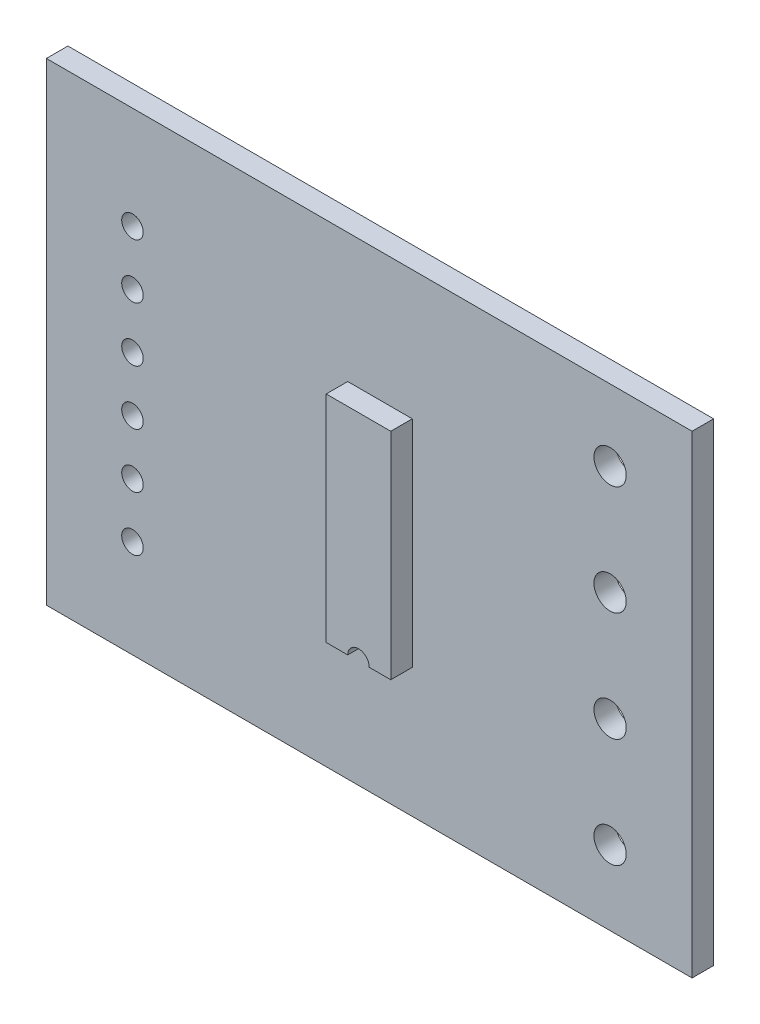
ISO-10303-21;
HEADER;
FILE_DESCRIPTION(('STEP AP214'),'2;1');
FILE_NAME('part.step','',(''),(''),'','','');
FILE_SCHEMA(('AUTOMOTIVE_DESIGN { 1 0 10303 214 1 1 1 1 }'));
ENDSEC;
DATA;
#1=APPLICATION_CONTEXT('core data for automotive mechanical design processes');
#2=APPLICATION_PROTOCOL_DEFINITION('international standard','automotive_design',2000,#1);
#3=PRODUCT_CONTEXT('',#1,'mechanical');
#4=PRODUCT('Part','Part','',(#3));
#5=PRODUCT_RELATED_PRODUCT_CATEGORY('part','',(#4));
#6=PRODUCT_DEFINITION_FORMATION('','',#4);
#7=PRODUCT_DEFINITION_CONTEXT('part definition',#1,'design');
#8=PRODUCT_DEFINITION('design','',#6,#7);
#9=PRODUCT_DEFINITION_SHAPE('','',#8);
#10=(LENGTH_UNIT() NAMED_UNIT(*) SI_UNIT(.MILLI.,.METRE.));
#11=(NAMED_UNIT(*) PLANE_ANGLE_UNIT() SI_UNIT($,.RADIAN.));
#12=(NAMED_UNIT(*) SI_UNIT($,.STERADIAN.) SOLID_ANGLE_UNIT());
#13=UNCERTAINTY_MEASURE_WITH_UNIT(LENGTH_MEASURE(1.E-05),#10,'distance_accuracy_value','');
#14=(GEOMETRIC_REPRESENTATION_CONTEXT(3) GLOBAL_UNCERTAINTY_ASSIGNED_CONTEXT((#13)) GLOBAL_UNIT_ASSIGNED_CONTEXT((#10,
#11,#12)) REPRESENTATION_CONTEXT('',''));
#15=CARTESIAN_POINT('',(0.,0.,0.));
#16=DIRECTION('',(0.,0.,1.));
#17=DIRECTION('',(1.,0.,0.));
#18=AXIS2_PLACEMENT_3D('',#15,#16,#17);
#19=CARTESIAN_POINT('',(14.,6.,2.));
#20=DIRECTION('',(0.,1.,0.));
#21=DIRECTION('',(0.,0.,1.));
#22=AXIS2_PLACEMENT_3D('',#19,#20,#21);
#23=PLANE('',#22);
#24=DIRECTION('',(1.,0.,0.));
#25=VECTOR('',#24,1.);
#26=CARTESIAN_POINT('',(14.,6.,1.));
#27=LINE('',#26,#25);
#28=CARTESIAN_POINT('',(14.,6.,1.));
#29=VERTEX_POINT('',#28);
#30=CARTESIAN_POINT('',(15.,6.,1.));
#31=VERTEX_POINT('',#30);
#32=EDGE_CURVE('E67',#29,#31,#27,.T.);
#33=ORIENTED_EDGE('',*,*,#32,.T.);
#34=DIRECTION('',(0.,0.,1.));
#35=VECTOR('',#34,1.);
#36=CARTESIAN_POINT('',(15.,6.,1.));
#37=LINE('',#36,#35);
#38=CARTESIAN_POINT('',(15.,6.,2.));
#39=VERTEX_POINT('',#38);
#40=EDGE_CURVE('E122',#31,#39,#37,.T.);
#41=ORIENTED_EDGE('',*,*,#40,.T.);
#42=DIRECTION('',(1.,0.,0.));
#43=VECTOR('',#42,1.);
#44=CARTESIAN_POINT('',(14.,6.,2.));
#45=LINE('',#44,#43);
#46=CARTESIAN_POINT('',(14.,6.,2.));
#47=VERTEX_POINT('',#46);
#48=EDGE_CURVE('E569',#47,#39,#45,.T.);
#49=ORIENTED_EDGE('',*,*,#48,.F.);
#50=DIRECTION('',(0.,0.,-1.));
#51=VECTOR('',#50,1.);
#52=CARTESIAN_POINT('',(14.,6.,2.));
#53=LINE('',#52,#51);
#54=EDGE_CURVE('E168',#47,#29,#53,.T.);
#55=ORIENTED_EDGE('',*,*,#54,.T.);
#56=EDGE_LOOP('',(#33,#41,#49,#55));
#57=FACE_BOUND('',#56,.T.);
#58=ADVANCED_FACE('F43',(#57),#23,.F.);
#59=CARTESIAN_POINT('',(0.,0.,1.));
#60=DIRECTION('',(0.,0.,-1.));
#61=DIRECTION('',(-1.,0.,0.));
#62=AXIS2_PLACEMENT_3D('',#59,#60,#61);
#63=PLANE('',#62);
#64=DIRECTION('',(0.,-1.,0.));
#65=VECTOR('',#64,1.);
#66=CARTESIAN_POINT('',(0.,0.,1.));
#67=LINE('',#66,#65);
#68=CARTESIAN_POINT('',(0.,22.,1.));
#69=VERTEX_POINT('',#68);
#70=CARTESIAN_POINT('',(0.,0.,1.));
#71=VERTEX_POINT('',#70);
#72=EDGE_CURVE('E252',#69,#71,#67,.T.);
#73=ORIENTED_EDGE('',*,*,#72,.T.);
#74=DIRECTION('',(1.,0.,0.));
#75=VECTOR('',#74,1.);
#76=CARTESIAN_POINT('',(0.,0.,1.));
#77=LINE('',#76,#75);
#78=CARTESIAN_POINT('',(30.,0.,1.));
#79=VERTEX_POINT('',#78);
#80=EDGE_CURVE('E256',#71,#79,#77,.T.);
#81=ORIENTED_EDGE('',*,*,#80,.T.);
#82=DIRECTION('',(0.,1.,0.));
#83=VECTOR('',#82,1.);
#84=CARTESIAN_POINT('',(30.,0.,1.));
#85=LINE('',#84,#83);
#86=CARTESIAN_POINT('',(30.,22.,1.));
#87=VERTEX_POINT('',#86);
#88=EDGE_CURVE('E260',#79,#87,#85,.T.);
#89=ORIENTED_EDGE('',*,*,#88,.T.);
#90=DIRECTION('',(-1.,0.,0.));
#91=VECTOR('',#90,1.);
#92=CARTESIAN_POINT('',(0.,22.,1.));
#93=LINE('',#92,#91);
#94=EDGE_CURVE('E263',#87,#69,#93,.T.);
#95=ORIENTED_EDGE('',*,*,#94,.T.);
#96=EDGE_LOOP('',(#73,#81,#89,#95));
#97=FACE_BOUND('',#96,.T.);
#98=CARTESIAN_POINT('',(4.,17.25,1.));
#99=DIRECTION('',(0.,0.,1.));
#100=DIRECTION('',(1.,0.,0.));
#101=AXIS2_PLACEMENT_3D('',#98,#99,#100);
#102=CIRCLE('',#101,0.500000000000001);
#103=CARTESIAN_POINT('',(4.5,17.25,1.));
#104=VERTEX_POINT('',#103);
#105=EDGE_CURVE('E216',#104,#104,#102,.T.);
#106=ORIENTED_EDGE('',*,*,#105,.F.);
#107=EDGE_LOOP('',(#106));
#108=FACE_BOUND('',#107,.T.);
#109=CARTESIAN_POINT('',(26.19,3.45,1.));
#110=DIRECTION('',(0.,0.,1.));
#111=DIRECTION('',(1.,0.,0.));
#112=AXIS2_PLACEMENT_3D('',#109,#110,#111);
#113=CIRCLE('',#112,0.750000000000002);
#114=CARTESIAN_POINT('',(26.94,3.45,1.));
#115=VERTEX_POINT('',#114);
#116=EDGE_CURVE('E172',#115,#115,#113,.T.);
#117=ORIENTED_EDGE('',*,*,#116,.F.);
#118=EDGE_LOOP('',(#117));
#119=FACE_BOUND('',#118,.T.);
#120=CARTESIAN_POINT('',(4.,14.71,1.));
#121=DIRECTION('',(0.,0.,1.));
#122=DIRECTION('',(1.,0.,0.));
#123=AXIS2_PLACEMENT_3D('',#120,#121,#122);
#124=CIRCLE('',#123,0.500000000000001);
#125=CARTESIAN_POINT('',(4.5,14.71,1.));
#126=VERTEX_POINT('',#125);
#127=EDGE_CURVE('E212',#126,#126,#124,.T.);
#128=ORIENTED_EDGE('',*,*,#127,.F.);
#129=EDGE_LOOP('',(#128));
#130=FACE_BOUND('',#129,.T.);
#131=CARTESIAN_POINT('',(4.,12.17,1.));
#132=DIRECTION('',(0.,0.,1.));
#133=DIRECTION('',(1.,0.,0.));
#134=AXIS2_PLACEMENT_3D('',#131,#132,#133);
#135=CIRCLE('',#134,0.500000000000001);
#136=CARTESIAN_POINT('',(4.5,12.17,1.));
#137=VERTEX_POINT('',#136);
#138=EDGE_CURVE('E221',#137,#137,#135,.T.);
#139=ORIENTED_EDGE('',*,*,#138,.F.);
#140=EDGE_LOOP('',(#139));
#141=FACE_BOUND('',#140,.T.);
#142=CARTESIAN_POINT('',(4.,9.63,1.));
#143=DIRECTION('',(0.,0.,1.));
#144=DIRECTION('',(1.,0.,0.));
#145=AXIS2_PLACEMENT_3D('',#142,#143,#144);
#146=CIRCLE('',#145,0.500000000000001);
#147=CARTESIAN_POINT('',(4.5,9.63,1.));
#148=VERTEX_POINT('',#147);
#149=EDGE_CURVE('E229',#148,#148,#146,.T.);
#150=ORIENTED_EDGE('',*,*,#149,.F.);
#151=EDGE_LOOP('',(#150));
#152=FACE_BOUND('',#151,.T.);
#153=CARTESIAN_POINT('',(4.,7.09,1.));
#154=DIRECTION('',(0.,0.,1.));
#155=DIRECTION('',(1.,0.,0.));
#156=AXIS2_PLACEMENT_3D('',#153,#154,#155);
#157=CIRCLE('',#156,0.500000000000001);
#158=CARTESIAN_POINT('',(4.5,7.09,1.));
#159=VERTEX_POINT('',#158);
#160=EDGE_CURVE('E237',#159,#159,#157,.T.);
#161=ORIENTED_EDGE('',*,*,#160,.F.);
#162=EDGE_LOOP('',(#161));
#163=FACE_BOUND('',#162,.T.);
#164=CARTESIAN_POINT('',(26.19,8.53,1.));
#165=DIRECTION('',(0.,0.,1.));
#166=DIRECTION('',(1.,0.,0.));
#167=AXIS2_PLACEMENT_3D('',#164,#165,#166);
#168=CIRCLE('',#167,0.750000000000002);
#169=CARTESIAN_POINT('',(26.94,8.53,1.));
#170=VERTEX_POINT('',#169);
#171=EDGE_CURVE('E189',#170,#170,#168,.T.);
#172=ORIENTED_EDGE('',*,*,#171,.F.);
#173=EDGE_LOOP('',(#172));
#174=FACE_BOUND('',#173,.T.);
#175=CARTESIAN_POINT('',(26.19,13.61,1.));
#176=DIRECTION('',(0.,0.,1.));
#177=DIRECTION('',(1.,0.,0.));
#178=AXIS2_PLACEMENT_3D('',#175,#176,#177);
#179=CIRCLE('',#178,0.750000000000002);
#180=CARTESIAN_POINT('',(26.94,13.61,1.));
#181=VERTEX_POINT('',#180);
#182=EDGE_CURVE('E180',#181,#181,#179,.T.);
#183=ORIENTED_EDGE('',*,*,#182,.F.);
#184=EDGE_LOOP('',(#183));
#185=FACE_BOUND('',#184,.T.);
#186=CARTESIAN_POINT('',(26.19,18.69,1.));
#187=DIRECTION('',(0.,0.,1.));
#188=DIRECTION('',(1.,0.,0.));
#189=AXIS2_PLACEMENT_3D('',#186,#187,#188);
#190=CIRCLE('',#189,0.750000000000002);
#191=CARTESIAN_POINT('',(26.94,18.69,1.));
#192=VERTEX_POINT('',#191);
#193=EDGE_CURVE('E205',#192,#192,#190,.T.);
#194=ORIENTED_EDGE('',*,*,#193,.F.);
#195=EDGE_LOOP('',(#194));
#196=FACE_BOUND('',#195,.T.);
#197=CARTESIAN_POINT('',(4.,4.55,1.));
#198=DIRECTION('',(0.,0.,1.));
#199=DIRECTION('',(1.,0.,0.));
#200=AXIS2_PLACEMENT_3D('',#197,#198,#199);
#201=CIRCLE('',#200,0.500000000000001);
#202=CARTESIAN_POINT('',(4.5,4.55,1.));
#203=VERTEX_POINT('',#202);
#204=EDGE_CURVE('E196',#203,#203,#201,.T.);
#205=ORIENTED_EDGE('',*,*,#204,.F.);
#206=EDGE_LOOP('',(#205));
#207=FACE_BOUND('',#206,.T.);
#208=CARTESIAN_POINT('',(16.,6.,1.));
#209=VERTEX_POINT('',#208);
#210=CARTESIAN_POINT('',(17.,6.,1.));
#211=VERTEX_POINT('',#210);
#212=EDGE_CURVE('E131',#209,#211,#27,.T.);
#213=ORIENTED_EDGE('',*,*,#212,.F.);
#214=CARTESIAN_POINT('',(15.5,6.,1.));
#215=DIRECTION('',(0.,0.,1.));
#216=DIRECTION('',(1.,0.,0.));
#217=AXIS2_PLACEMENT_3D('',#214,#215,#216);
#218=CIRCLE('',#217,0.499999999999997);
#219=EDGE_CURVE('E119',#209,#31,#218,.T.);
#220=ORIENTED_EDGE('',*,*,#219,.T.);
#221=ORIENTED_EDGE('',*,*,#32,.F.);
#222=DIRECTION('',(0.,-1.,0.));
#223=VECTOR('',#222,1.);
#224=CARTESIAN_POINT('',(14.,16.,1.));
#225=LINE('',#224,#223);
#226=CARTESIAN_POINT('',(14.,16.,1.));
#227=VERTEX_POINT('',#226);
#228=EDGE_CURVE('E141',#227,#29,#225,.T.);
#229=ORIENTED_EDGE('',*,*,#228,.F.);
#230=DIRECTION('',(-1.,0.,0.));
#231=VECTOR('',#230,1.);
#232=CARTESIAN_POINT('',(14.,16.,1.));
#233=LINE('',#232,#231);
#234=CARTESIAN_POINT('',(17.,16.,1.));
#235=VERTEX_POINT('',#234);
#236=EDGE_CURVE('E151',#235,#227,#233,.T.);
#237=ORIENTED_EDGE('',*,*,#236,.F.);
#238=DIRECTION('',(0.,1.,0.));
#239=VECTOR('',#238,1.);
#240=CARTESIAN_POINT('',(17.,16.,1.));
#241=LINE('',#240,#239);
#242=EDGE_CURVE('E138',#211,#235,#241,.T.);
#243=ORIENTED_EDGE('',*,*,#242,.F.);
#244=EDGE_LOOP('',(#213,#220,#221,#229,#237,#243));
#245=FACE_BOUND('',#244,.T.);
#246=ADVANCED_FACE('F136',(#97,#108,#119,#130,#141,#152,#163,#174,#185,#196,#207,#245),#63,.F.);
#247=CARTESIAN_POINT('',(0.,0.,1.));
#248=DIRECTION('',(1.,0.,0.));
#249=DIRECTION('',(0.,0.,-1.));
#250=AXIS2_PLACEMENT_3D('',#247,#248,#249);
#251=PLANE('',#250);
#252=DIRECTION('',(0.,-1.,0.));
#253=VECTOR('',#252,1.);
#254=CARTESIAN_POINT('',(0.,0.,0.));
#255=LINE('',#254,#253);
#256=CARTESIAN_POINT('',(0.,22.,0.));
#257=VERTEX_POINT('',#256);
#258=CARTESIAN_POINT('',(0.,0.,0.));
#259=VERTEX_POINT('',#258);
#260=EDGE_CURVE('E248',#257,#259,#255,.T.);
#261=ORIENTED_EDGE('',*,*,#260,.T.);
#262=DIRECTION('',(0.,0.,-1.));
#263=VECTOR('',#262,1.);
#264=CARTESIAN_POINT('',(0.,0.,1.));
#265=LINE('',#264,#263);
#266=EDGE_CURVE('E11',#71,#259,#265,.T.);
#267=ORIENTED_EDGE('',*,*,#266,.F.);
#268=ORIENTED_EDGE('',*,*,#72,.F.);
#269=DIRECTION('',(0.,0.,-1.));
#270=VECTOR('',#269,1.);
#271=CARTESIAN_POINT('',(0.,22.,1.));
#272=LINE('',#271,#270);
#273=EDGE_CURVE('E266',#69,#257,#272,.T.);
#274=ORIENTED_EDGE('',*,*,#273,.T.);
#275=EDGE_LOOP('',(#261,#267,#268,#274));
#276=FACE_BOUND('',#275,.T.);
#277=ADVANCED_FACE('F45',(#276),#251,.F.);
#278=CARTESIAN_POINT('',(0.,0.,1.));
#279=DIRECTION('',(0.,1.,0.));
#280=DIRECTION('',(0.,0.,1.));
#281=AXIS2_PLACEMENT_3D('',#278,#279,#280);
#282=PLANE('',#281);
#283=DIRECTION('',(1.,0.,0.));
#284=VECTOR('',#283,1.);
#285=CARTESIAN_POINT('',(0.,0.,0.));
#286=LINE('',#285,#284);
#287=CARTESIAN_POINT('',(30.,0.,0.));
#288=VERTEX_POINT('',#287);
#289=EDGE_CURVE('E270',#259,#288,#286,.T.);
#290=ORIENTED_EDGE('',*,*,#289,.T.);
#291=DIRECTION('',(0.,0.,-1.));
#292=VECTOR('',#291,1.);
#293=CARTESIAN_POINT('',(30.,0.,1.));
#294=LINE('',#293,#292);
#295=EDGE_CURVE('E52',#79,#288,#294,.T.);
#296=ORIENTED_EDGE('',*,*,#295,.F.);
#297=ORIENTED_EDGE('',*,*,#80,.F.);
#298=ORIENTED_EDGE('',*,*,#266,.T.);
#299=EDGE_LOOP('',(#290,#296,#297,#298));
#300=FACE_BOUND('',#299,.T.);
#301=ADVANCED_FACE('F306',(#300),#282,.F.);
#302=CARTESIAN_POINT('',(30.,0.,1.));
#303=DIRECTION('',(-1.,0.,0.));
#304=DIRECTION('',(0.,0.,1.));
#305=AXIS2_PLACEMENT_3D('',#302,#303,#304);
#306=PLANE('',#305);
#307=DIRECTION('',(0.,1.,0.));
#308=VECTOR('',#307,1.);
#309=CARTESIAN_POINT('',(30.,0.,0.));
#310=LINE('',#309,#308);
#311=CARTESIAN_POINT('',(30.,22.,0.));
#312=VERTEX_POINT('',#311);
#313=EDGE_CURVE('E273',#288,#312,#310,.T.);
#314=ORIENTED_EDGE('',*,*,#313,.T.);
#315=DIRECTION('',(0.,0.,-1.));
#316=VECTOR('',#315,1.);
#317=CARTESIAN_POINT('',(30.,22.,1.));
#318=LINE('',#317,#316);
#319=EDGE_CURVE('E281',#87,#312,#318,.T.);
#320=ORIENTED_EDGE('',*,*,#319,.F.);
#321=ORIENTED_EDGE('',*,*,#88,.F.);
#322=ORIENTED_EDGE('',*,*,#295,.T.);
#323=EDGE_LOOP('',(#314,#320,#321,#322));
#324=FACE_BOUND('',#323,.T.);
#325=ADVANCED_FACE('F290',(#324),#306,.F.);
#326=CARTESIAN_POINT('',(0.,22.,1.));
#327=DIRECTION('',(0.,-1.,0.));
#328=DIRECTION('',(0.,0.,-1.));
#329=AXIS2_PLACEMENT_3D('',#326,#327,#328);
#330=PLANE('',#329);
#331=DIRECTION('',(-1.,0.,0.));
#332=VECTOR('',#331,1.);
#333=CARTESIAN_POINT('',(0.,22.,0.));
#334=LINE('',#333,#332);
#335=EDGE_CURVE('E257',#312,#257,#334,.T.);
#336=ORIENTED_EDGE('',*,*,#335,.T.);
#337=ORIENTED_EDGE('',*,*,#273,.F.);
#338=ORIENTED_EDGE('',*,*,#94,.F.);
#339=ORIENTED_EDGE('',*,*,#319,.T.);
#340=EDGE_LOOP('',(#336,#337,#338,#339));
#341=FACE_BOUND('',#340,.T.);
#342=ADVANCED_FACE('F299',(#341),#330,.F.);
#343=CARTESIAN_POINT('',(0.,0.,0.));
#344=DIRECTION('',(0.,0.,-1.));
#345=DIRECTION('',(-1.,0.,0.));
#346=AXIS2_PLACEMENT_3D('',#343,#344,#345);
#347=PLANE('',#346);
#348=CARTESIAN_POINT('',(4.,4.55,0.));
#349=DIRECTION('',(0.,0.,1.));
#350=DIRECTION('',(1.,0.,0.));
#351=AXIS2_PLACEMENT_3D('',#348,#349,#350);
#352=CIRCLE('',#351,0.500000000000001);
#353=CARTESIAN_POINT('',(4.5,4.55,0.));
#354=VERTEX_POINT('',#353);
#355=EDGE_CURVE('E201',#354,#354,#352,.T.);
#356=ORIENTED_EDGE('',*,*,#355,.T.);
#357=EDGE_LOOP('',(#356));
#358=FACE_BOUND('',#357,.T.);
#359=CARTESIAN_POINT('',(26.19,18.69,0.));
#360=DIRECTION('',(0.,0.,1.));
#361=DIRECTION('',(1.,0.,0.));
#362=AXIS2_PLACEMENT_3D('',#359,#360,#361);
#363=CIRCLE('',#362,0.750000000000002);
#364=CARTESIAN_POINT('',(26.94,18.69,0.));
#365=VERTEX_POINT('',#364);
#366=EDGE_CURVE('E184',#365,#365,#363,.T.);
#367=ORIENTED_EDGE('',*,*,#366,.T.);
#368=EDGE_LOOP('',(#367));
#369=FACE_BOUND('',#368,.T.);
#370=CARTESIAN_POINT('',(26.19,13.61,0.));
#371=DIRECTION('',(0.,0.,1.));
#372=DIRECTION('',(1.,0.,0.));
#373=AXIS2_PLACEMENT_3D('',#370,#371,#372);
#374=CIRCLE('',#373,0.750000000000002);
#375=CARTESIAN_POINT('',(26.94,13.61,0.));
#376=VERTEX_POINT('',#375);
#377=EDGE_CURVE('E185',#376,#376,#374,.T.);
#378=ORIENTED_EDGE('',*,*,#377,.T.);
#379=EDGE_LOOP('',(#378));
#380=FACE_BOUND('',#379,.T.);
#381=CARTESIAN_POINT('',(26.19,8.53,0.));
#382=DIRECTION('',(0.,0.,1.));
#383=DIRECTION('',(1.,0.,0.));
#384=AXIS2_PLACEMENT_3D('',#381,#382,#383);
#385=CIRCLE('',#384,0.750000000000002);
#386=CARTESIAN_POINT('',(26.94,8.53,0.));
#387=VERTEX_POINT('',#386);
#388=EDGE_CURVE('E176',#387,#387,#385,.T.);
#389=ORIENTED_EDGE('',*,*,#388,.T.);
#390=EDGE_LOOP('',(#389));
#391=FACE_BOUND('',#390,.T.);
#392=CARTESIAN_POINT('',(4.,7.09,0.));
#393=DIRECTION('',(0.,0.,1.));
#394=DIRECTION('',(1.,0.,0.));
#395=AXIS2_PLACEMENT_3D('',#392,#393,#394);
#396=CIRCLE('',#395,0.500000000000001);
#397=CARTESIAN_POINT('',(4.5,7.09,0.));
#398=VERTEX_POINT('',#397);
#399=EDGE_CURVE('E200',#398,#398,#396,.T.);
#400=ORIENTED_EDGE('',*,*,#399,.T.);
#401=EDGE_LOOP('',(#400));
#402=FACE_BOUND('',#401,.T.);
#403=CARTESIAN_POINT('',(4.,9.63,0.));
#404=DIRECTION('',(0.,0.,1.));
#405=DIRECTION('',(1.,0.,0.));
#406=AXIS2_PLACEMENT_3D('',#403,#404,#405);
#407=CIRCLE('',#406,0.500000000000001);
#408=CARTESIAN_POINT('',(4.5,9.63,0.));
#409=VERTEX_POINT('',#408);
#410=EDGE_CURVE('E233',#409,#409,#407,.T.);
#411=ORIENTED_EDGE('',*,*,#410,.T.);
#412=EDGE_LOOP('',(#411));
#413=FACE_BOUND('',#412,.T.);
#414=CARTESIAN_POINT('',(4.,12.17,0.));
#415=DIRECTION('',(0.,0.,1.));
#416=DIRECTION('',(1.,0.,0.));
#417=AXIS2_PLACEMENT_3D('',#414,#415,#416);
#418=CIRCLE('',#417,0.500000000000001);
#419=CARTESIAN_POINT('',(4.5,12.17,0.));
#420=VERTEX_POINT('',#419);
#421=EDGE_CURVE('E225',#420,#420,#418,.T.);
#422=ORIENTED_EDGE('',*,*,#421,.T.);
#423=EDGE_LOOP('',(#422));
#424=FACE_BOUND('',#423,.T.);
#425=CARTESIAN_POINT('',(4.,14.71,0.));
#426=DIRECTION('',(0.,0.,1.));
#427=DIRECTION('',(1.,0.,0.));
#428=AXIS2_PLACEMENT_3D('',#425,#426,#427);
#429=CIRCLE('',#428,0.500000000000001);
#430=CARTESIAN_POINT('',(4.5,14.71,0.));
#431=VERTEX_POINT('',#430);
#432=EDGE_CURVE('E217',#431,#431,#429,.T.);
#433=ORIENTED_EDGE('',*,*,#432,.T.);
#434=EDGE_LOOP('',(#433));
#435=FACE_BOUND('',#434,.T.);
#436=CARTESIAN_POINT('',(26.19,3.45,0.));
#437=DIRECTION('',(0.,0.,1.));
#438=DIRECTION('',(1.,0.,0.));
#439=AXIS2_PLACEMENT_3D('',#436,#437,#438);
#440=CIRCLE('',#439,0.750000000000002);
#441=CARTESIAN_POINT('',(26.94,3.45,0.));
#442=VERTEX_POINT('',#441);
#443=EDGE_CURVE('E171',#442,#442,#440,.T.);
#444=ORIENTED_EDGE('',*,*,#443,.T.);
#445=EDGE_LOOP('',(#444));
#446=FACE_BOUND('',#445,.T.);
#447=CARTESIAN_POINT('',(4.,17.25,0.));
#448=DIRECTION('',(0.,0.,1.));
#449=DIRECTION('',(1.,0.,0.));
#450=AXIS2_PLACEMENT_3D('',#447,#448,#449);
#451=CIRCLE('',#450,0.500000000000001);
#452=CARTESIAN_POINT('',(4.5,17.25,0.));
#453=VERTEX_POINT('',#452);
#454=EDGE_CURVE('E244',#453,#453,#451,.T.);
#455=ORIENTED_EDGE('',*,*,#454,.T.);
#456=EDGE_LOOP('',(#455));
#457=FACE_BOUND('',#456,.T.);
#458=ORIENTED_EDGE('',*,*,#260,.F.);
#459=ORIENTED_EDGE('',*,*,#335,.F.);
#460=ORIENTED_EDGE('',*,*,#313,.F.);
#461=ORIENTED_EDGE('',*,*,#289,.F.);
#462=EDGE_LOOP('',(#458,#459,#460,#461));
#463=FACE_BOUND('',#462,.T.);
#464=ADVANCED_FACE('F296',(#358,#369,#380,#391,#402,#413,#424,#435,#446,#457,#463),#347,.T.);
#465=CARTESIAN_POINT('',(4.,17.25,0.));
#466=DIRECTION('',(0.,0.,1.));
#467=DIRECTION('',(1.,0.,0.));
#468=AXIS2_PLACEMENT_3D('',#465,#466,#467);
#469=CYLINDRICAL_SURFACE('',#468,0.500000000000001);
#470=ORIENTED_EDGE('',*,*,#454,.F.);
#471=EDGE_LOOP('',(#470));
#472=FACE_BOUND('',#471,.T.);
#473=ORIENTED_EDGE('',*,*,#105,.T.);
#474=EDGE_LOOP('',(#473));
#475=FACE_BOUND('',#474,.T.);
#476=ADVANCED_FACE('F344',(#472,#475),#469,.F.);
#477=CARTESIAN_POINT('',(26.19,3.45,0.));
#478=DIRECTION('',(0.,0.,1.));
#479=DIRECTION('',(1.,0.,0.));
#480=AXIS2_PLACEMENT_3D('',#477,#478,#479);
#481=CYLINDRICAL_SURFACE('',#480,0.750000000000002);
#482=ORIENTED_EDGE('',*,*,#443,.F.);
#483=EDGE_LOOP('',(#482));
#484=FACE_BOUND('',#483,.T.);
#485=ORIENTED_EDGE('',*,*,#116,.T.);
#486=EDGE_LOOP('',(#485));
#487=FACE_BOUND('',#486,.T.);
#488=ADVANCED_FACE('F340',(#484,#487),#481,.F.);
#489=CARTESIAN_POINT('',(4.,14.71,0.));
#490=DIRECTION('',(0.,0.,1.));
#491=DIRECTION('',(1.,0.,0.));
#492=AXIS2_PLACEMENT_3D('',#489,#490,#491);
#493=CYLINDRICAL_SURFACE('',#492,0.500000000000001);
#494=ORIENTED_EDGE('',*,*,#432,.F.);
#495=EDGE_LOOP('',(#494));
#496=FACE_BOUND('',#495,.T.);
#497=ORIENTED_EDGE('',*,*,#127,.T.);
#498=EDGE_LOOP('',(#497));
#499=FACE_BOUND('',#498,.T.);
#500=ADVANCED_FACE('F343',(#496,#499),#493,.F.);
#501=CARTESIAN_POINT('',(4.,12.17,0.));
#502=DIRECTION('',(0.,0.,1.));
#503=DIRECTION('',(1.,0.,0.));
#504=AXIS2_PLACEMENT_3D('',#501,#502,#503);
#505=CYLINDRICAL_SURFACE('',#504,0.500000000000001);
#506=ORIENTED_EDGE('',*,*,#421,.F.);
#507=EDGE_LOOP('',(#506));
#508=FACE_BOUND('',#507,.T.);
#509=ORIENTED_EDGE('',*,*,#138,.T.);
#510=EDGE_LOOP('',(#509));
#511=FACE_BOUND('',#510,.T.);
#512=ADVANCED_FACE('F360',(#508,#511),#505,.F.);
#513=CARTESIAN_POINT('',(4.,9.63,0.));
#514=DIRECTION('',(0.,0.,1.));
#515=DIRECTION('',(1.,0.,0.));
#516=AXIS2_PLACEMENT_3D('',#513,#514,#515);
#517=CYLINDRICAL_SURFACE('',#516,0.500000000000001);
#518=ORIENTED_EDGE('',*,*,#410,.F.);
#519=EDGE_LOOP('',(#518));
#520=FACE_BOUND('',#519,.T.);
#521=ORIENTED_EDGE('',*,*,#149,.T.);
#522=EDGE_LOOP('',(#521));
#523=FACE_BOUND('',#522,.T.);
#524=ADVANCED_FACE('F364',(#520,#523),#517,.F.);
#525=CARTESIAN_POINT('',(4.,7.09,0.));
#526=DIRECTION('',(0.,0.,1.));
#527=DIRECTION('',(1.,0.,0.));
#528=AXIS2_PLACEMENT_3D('',#525,#526,#527);
#529=CYLINDRICAL_SURFACE('',#528,0.500000000000001);
#530=ORIENTED_EDGE('',*,*,#399,.F.);
#531=EDGE_LOOP('',(#530));
#532=FACE_BOUND('',#531,.T.);
#533=ORIENTED_EDGE('',*,*,#160,.T.);
#534=EDGE_LOOP('',(#533));
#535=FACE_BOUND('',#534,.T.);
#536=ADVANCED_FACE('F352',(#532,#535),#529,.F.);
#537=CARTESIAN_POINT('',(26.19,8.53,0.));
#538=DIRECTION('',(0.,0.,1.));
#539=DIRECTION('',(1.,0.,0.));
#540=AXIS2_PLACEMENT_3D('',#537,#538,#539);
#541=CYLINDRICAL_SURFACE('',#540,0.750000000000002);
#542=ORIENTED_EDGE('',*,*,#388,.F.);
#543=EDGE_LOOP('',(#542));
#544=FACE_BOUND('',#543,.T.);
#545=ORIENTED_EDGE('',*,*,#171,.T.);
#546=EDGE_LOOP('',(#545));
#547=FACE_BOUND('',#546,.T.);
#548=ADVANCED_FACE('F349',(#544,#547),#541,.F.);
#549=CARTESIAN_POINT('',(26.19,13.61,0.));
#550=DIRECTION('',(0.,0.,1.));
#551=DIRECTION('',(1.,0.,0.));
#552=AXIS2_PLACEMENT_3D('',#549,#550,#551);
#553=CYLINDRICAL_SURFACE('',#552,0.750000000000002);
#554=ORIENTED_EDGE('',*,*,#377,.F.);
#555=EDGE_LOOP('',(#554));
#556=FACE_BOUND('',#555,.T.);
#557=ORIENTED_EDGE('',*,*,#182,.T.);
#558=EDGE_LOOP('',(#557));
#559=FACE_BOUND('',#558,.T.);
#560=ADVANCED_FACE('F346',(#556,#559),#553,.F.);
#561=CARTESIAN_POINT('',(26.19,18.69,0.));
#562=DIRECTION('',(0.,0.,1.));
#563=DIRECTION('',(1.,0.,0.));
#564=AXIS2_PLACEMENT_3D('',#561,#562,#563);
#565=CYLINDRICAL_SURFACE('',#564,0.750000000000002);
#566=ORIENTED_EDGE('',*,*,#366,.F.);
#567=EDGE_LOOP('',(#566));
#568=FACE_BOUND('',#567,.T.);
#569=ORIENTED_EDGE('',*,*,#193,.T.);
#570=EDGE_LOOP('',(#569));
#571=FACE_BOUND('',#570,.T.);
#572=ADVANCED_FACE('F336',(#568,#571),#565,.F.);
#573=CARTESIAN_POINT('',(4.,4.55,0.));
#574=DIRECTION('',(0.,0.,1.));
#575=DIRECTION('',(1.,0.,0.));
#576=AXIS2_PLACEMENT_3D('',#573,#574,#575);
#577=CYLINDRICAL_SURFACE('',#576,0.500000000000001);
#578=ORIENTED_EDGE('',*,*,#355,.F.);
#579=EDGE_LOOP('',(#578));
#580=FACE_BOUND('',#579,.T.);
#581=ORIENTED_EDGE('',*,*,#204,.T.);
#582=EDGE_LOOP('',(#581));
#583=FACE_BOUND('',#582,.T.);
#584=ADVANCED_FACE('F331',(#580,#583),#577,.F.);
#585=CARTESIAN_POINT('',(14.,16.,2.));
#586=DIRECTION('',(1.,0.,0.));
#587=DIRECTION('',(0.,1.,0.));
#588=AXIS2_PLACEMENT_3D('',#585,#586,#587);
#589=PLANE('',#588);
#590=ORIENTED_EDGE('',*,*,#228,.T.);
#591=ORIENTED_EDGE('',*,*,#54,.F.);
#592=DIRECTION('',(0.,-1.,0.));
#593=VECTOR('',#592,1.);
#594=CARTESIAN_POINT('',(14.,16.,2.));
#595=LINE('',#594,#593);
#596=CARTESIAN_POINT('',(14.,16.,2.));
#597=VERTEX_POINT('',#596);
#598=EDGE_CURVE('E155',#597,#47,#595,.T.);
#599=ORIENTED_EDGE('',*,*,#598,.F.);
#600=DIRECTION('',(0.,0.,-1.));
#601=VECTOR('',#600,1.);
#602=CARTESIAN_POINT('',(14.,16.,2.));
#603=LINE('',#602,#601);
#604=EDGE_CURVE('E156',#597,#227,#603,.T.);
#605=ORIENTED_EDGE('',*,*,#604,.T.);
#606=EDGE_LOOP('',(#590,#591,#599,#605));
#607=FACE_BOUND('',#606,.T.);
#608=ADVANCED_FACE('F324',(#607),#589,.F.);
#609=CARTESIAN_POINT('',(16.,6.,2.));
#610=VERTEX_POINT('',#609);
#611=CARTESIAN_POINT('',(17.,6.,2.));
#612=VERTEX_POINT('',#611);
#613=EDGE_CURVE('E133',#610,#612,#45,.T.);
#614=ORIENTED_EDGE('',*,*,#613,.F.);
#615=DIRECTION('',(0.,0.,1.));
#616=VECTOR('',#615,1.);
#617=CARTESIAN_POINT('',(16.,6.,1.));
#618=LINE('',#617,#616);
#619=EDGE_CURVE('E59',#610,#209,#618,.F.);
#620=ORIENTED_EDGE('',*,*,#619,.T.);
#621=ORIENTED_EDGE('',*,*,#212,.T.);
#622=DIRECTION('',(0.,0.,-1.));
#623=VECTOR('',#622,1.);
#624=CARTESIAN_POINT('',(17.,6.,2.));
#625=LINE('',#624,#623);
#626=EDGE_CURVE('E165',#612,#211,#625,.T.);
#627=ORIENTED_EDGE('',*,*,#626,.F.);
#628=EDGE_LOOP('',(#614,#620,#621,#627));
#629=FACE_BOUND('',#628,.T.);
#630=ADVANCED_FACE('F129',(#629),#23,.F.);
#631=CARTESIAN_POINT('',(17.,16.,2.));
#632=DIRECTION('',(-1.,0.,0.));
#633=DIRECTION('',(0.,0.,1.));
#634=AXIS2_PLACEMENT_3D('',#631,#632,#633);
#635=PLANE('',#634);
#636=ORIENTED_EDGE('',*,*,#242,.T.);
#637=DIRECTION('',(0.,0.,-1.));
#638=VECTOR('',#637,1.);
#639=CARTESIAN_POINT('',(17.,16.,2.));
#640=LINE('',#639,#638);
#641=CARTESIAN_POINT('',(17.,16.,2.));
#642=VERTEX_POINT('',#641);
#643=EDGE_CURVE('E160',#642,#235,#640,.T.);
#644=ORIENTED_EDGE('',*,*,#643,.F.);
#645=DIRECTION('',(0.,1.,0.));
#646=VECTOR('',#645,1.);
#647=CARTESIAN_POINT('',(17.,16.,2.));
#648=LINE('',#647,#646);
#649=EDGE_CURVE('E579',#612,#642,#648,.T.);
#650=ORIENTED_EDGE('',*,*,#649,.F.);
#651=ORIENTED_EDGE('',*,*,#626,.T.);
#652=EDGE_LOOP('',(#636,#644,#650,#651));
#653=FACE_BOUND('',#652,.T.);
#654=ADVANCED_FACE('F323',(#653),#635,.F.);
#655=CARTESIAN_POINT('',(14.,16.,2.));
#656=DIRECTION('',(0.,-1.,0.));
#657=DIRECTION('',(0.,0.,-1.));
#658=AXIS2_PLACEMENT_3D('',#655,#656,#657);
#659=PLANE('',#658);
#660=ORIENTED_EDGE('',*,*,#236,.T.);
#661=ORIENTED_EDGE('',*,*,#604,.F.);
#662=DIRECTION('',(-1.,0.,0.));
#663=VECTOR('',#662,1.);
#664=CARTESIAN_POINT('',(14.,16.,2.));
#665=LINE('',#664,#663);
#666=EDGE_CURVE('E161',#642,#597,#665,.T.);
#667=ORIENTED_EDGE('',*,*,#666,.F.);
#668=ORIENTED_EDGE('',*,*,#643,.T.);
#669=EDGE_LOOP('',(#660,#661,#667,#668));
#670=FACE_BOUND('',#669,.T.);
#671=ADVANCED_FACE('F329',(#670),#659,.F.);
#672=CARTESIAN_POINT('',(0.,0.,2.));
#673=DIRECTION('',(0.,0.,1.));
#674=DIRECTION('',(1.,0.,0.));
#675=AXIS2_PLACEMENT_3D('',#672,#673,#674);
#676=PLANE('',#675);
#677=CARTESIAN_POINT('',(15.5,6.,2.));
#678=DIRECTION('',(0.,0.,1.));
#679=DIRECTION('',(1.,0.,0.));
#680=AXIS2_PLACEMENT_3D('',#677,#678,#679);
#681=CIRCLE('',#680,0.499999999999997);
#682=EDGE_CURVE('E125',#610,#39,#681,.T.);
#683=ORIENTED_EDGE('',*,*,#682,.F.);
#684=ORIENTED_EDGE('',*,*,#613,.T.);
#685=ORIENTED_EDGE('',*,*,#649,.T.);
#686=ORIENTED_EDGE('',*,*,#666,.T.);
#687=ORIENTED_EDGE('',*,*,#598,.T.);
#688=ORIENTED_EDGE('',*,*,#48,.T.);
#689=EDGE_LOOP('',(#683,#684,#685,#686,#687,#688));
#690=FACE_BOUND('',#689,.T.);
#691=ADVANCED_FACE('F450',(#690),#676,.T.);
#692=CARTESIAN_POINT('',(15.5,6.,1.));
#693=DIRECTION('',(0.,0.,1.));
#694=DIRECTION('',(1.,0.,0.));
#695=AXIS2_PLACEMENT_3D('',#692,#693,#694);
#696=CYLINDRICAL_SURFACE('',#695,0.499999999999997);
#697=ORIENTED_EDGE('',*,*,#219,.F.);
#698=ORIENTED_EDGE('',*,*,#619,.F.);
#699=ORIENTED_EDGE('',*,*,#682,.T.);
#700=ORIENTED_EDGE('',*,*,#40,.F.);
#701=EDGE_LOOP('',(#697,#698,#699,#700));
#702=FACE_BOUND('',#701,.T.);
#703=ADVANCED_FACE('F120',(#702),#696,.F.);
#704=CLOSED_SHELL('',(#58,#246,#277,#301,#325,#342,#464,#476,#488,#500,#512,#524,#536,#548,#560,
#572,#584,#608,#630,#654,#671,#691,#703));
#705=MANIFOLD_SOLID_BREP('B2',#704);
#706=ADVANCED_BREP_SHAPE_REPRESENTATION('',(#18,#705),#14);
#707=SHAPE_DEFINITION_REPRESENTATION(#9,#706);
ENDSEC;
END-ISO-10303-21;
